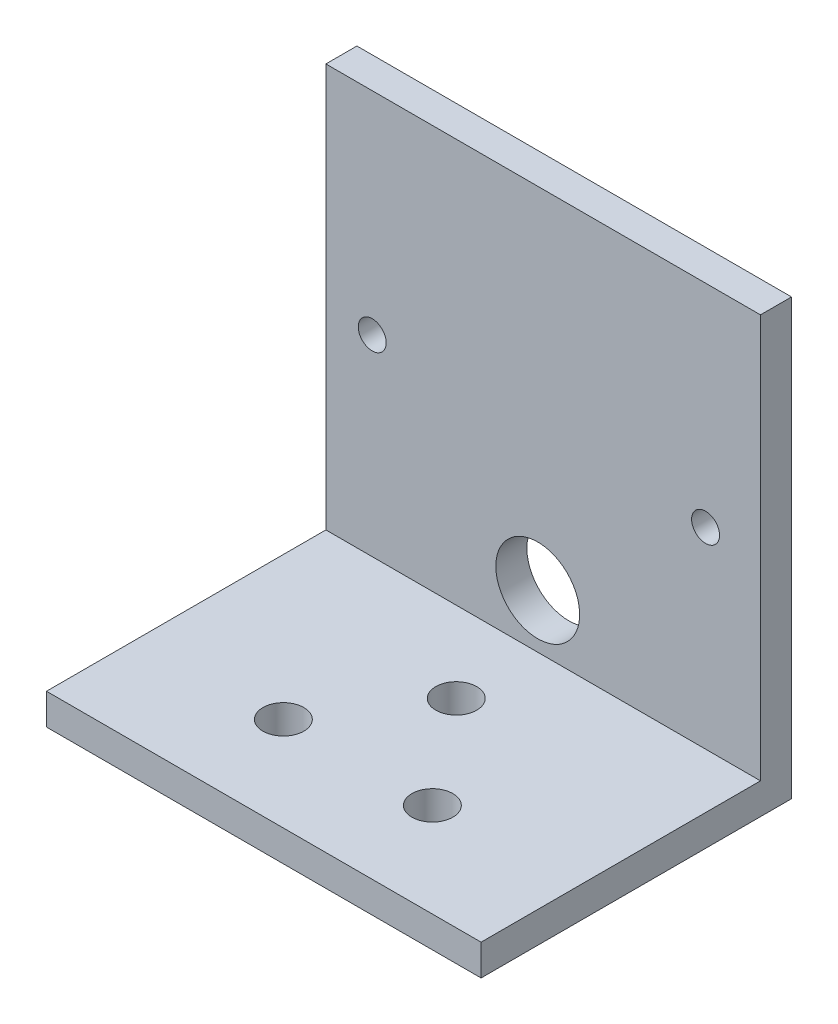
ISO-10303-21;
HEADER;
FILE_DESCRIPTION(('STEP AP214'),'2;1');
FILE_NAME('part.step','',(''),(''),'','','');
FILE_SCHEMA(('AUTOMOTIVE_DESIGN { 1 0 10303 214 1 1 1 1 }'));
ENDSEC;
DATA;
#1=APPLICATION_CONTEXT('core data for automotive mechanical design processes');
#2=APPLICATION_PROTOCOL_DEFINITION('international standard','automotive_design',2000,#1);
#3=PRODUCT_CONTEXT('',#1,'mechanical');
#4=PRODUCT('Part','Part','',(#3));
#5=PRODUCT_RELATED_PRODUCT_CATEGORY('part','',(#4));
#6=PRODUCT_DEFINITION_FORMATION('','',#4);
#7=PRODUCT_DEFINITION_CONTEXT('part definition',#1,'design');
#8=PRODUCT_DEFINITION('design','',#6,#7);
#9=PRODUCT_DEFINITION_SHAPE('','',#8);
#10=(LENGTH_UNIT() NAMED_UNIT(*) SI_UNIT(.MILLI.,.METRE.));
#11=(NAMED_UNIT(*) PLANE_ANGLE_UNIT() SI_UNIT($,.RADIAN.));
#12=(NAMED_UNIT(*) SI_UNIT($,.STERADIAN.) SOLID_ANGLE_UNIT());
#13=UNCERTAINTY_MEASURE_WITH_UNIT(LENGTH_MEASURE(1.E-05),#10,'distance_accuracy_value','');
#14=(GEOMETRIC_REPRESENTATION_CONTEXT(3) GLOBAL_UNCERTAINTY_ASSIGNED_CONTEXT((#13)) GLOBAL_UNIT_ASSIGNED_CONTEXT((#10,
#11,#12)) REPRESENTATION_CONTEXT('',''));
#15=CARTESIAN_POINT('',(0.,0.,0.));
#16=DIRECTION('',(0.,0.,1.));
#17=DIRECTION('',(1.,0.,0.));
#18=AXIS2_PLACEMENT_3D('',#15,#16,#17);
#19=CARTESIAN_POINT('',(35.,-35.,50.));
#20=DIRECTION('',(-1.,0.,0.));
#21=DIRECTION('',(0.,0.,1.));
#22=AXIS2_PLACEMENT_3D('',#19,#20,#21);
#23=PLANE('',#22);
#24=DIRECTION('',(0.,1.,0.));
#25=VECTOR('',#24,1.);
#26=CARTESIAN_POINT('',(35.,-30.,5.));
#27=LINE('',#26,#25);
#28=CARTESIAN_POINT('',(35.,-30.,5.));
#29=VERTEX_POINT('',#28);
#30=CARTESIAN_POINT('',(35.,35.,5.));
#31=VERTEX_POINT('',#30);
#32=EDGE_CURVE('E128',#29,#31,#27,.T.);
#33=ORIENTED_EDGE('',*,*,#32,.F.);
#34=DIRECTION('',(0.,0.,-1.));
#35=VECTOR('',#34,1.);
#36=CARTESIAN_POINT('',(35.,-30.,128.137615707359));
#37=LINE('',#36,#35);
#38=CARTESIAN_POINT('',(35.,-30.,50.));
#39=VERTEX_POINT('',#38);
#40=EDGE_CURVE('E131',#39,#29,#37,.T.);
#41=ORIENTED_EDGE('',*,*,#40,.F.);
#42=DIRECTION('',(0.,1.,0.));
#43=VECTOR('',#42,1.);
#44=CARTESIAN_POINT('',(35.,-35.,50.));
#45=LINE('',#44,#43);
#46=CARTESIAN_POINT('',(35.,-35.,50.));
#47=VERTEX_POINT('',#46);
#48=EDGE_CURVE('E86',#47,#39,#45,.T.);
#49=ORIENTED_EDGE('',*,*,#48,.F.);
#50=DIRECTION('',(0.,0.,-1.));
#51=VECTOR('',#50,1.);
#52=CARTESIAN_POINT('',(35.,-35.,50.));
#53=LINE('',#52,#51);
#54=CARTESIAN_POINT('',(35.,-35.,0.));
#55=VERTEX_POINT('',#54);
#56=EDGE_CURVE('E79',#47,#55,#53,.T.);
#57=ORIENTED_EDGE('',*,*,#56,.T.);
#58=DIRECTION('',(0.,1.,0.));
#59=VECTOR('',#58,1.);
#60=CARTESIAN_POINT('',(35.,-35.,0.));
#61=LINE('',#60,#59);
#62=CARTESIAN_POINT('',(35.,35.,0.));
#63=VERTEX_POINT('',#62);
#64=EDGE_CURVE('E93',#55,#63,#61,.T.);
#65=ORIENTED_EDGE('',*,*,#64,.T.);
#66=DIRECTION('',(0.,0.,-1.));
#67=VECTOR('',#66,1.);
#68=CARTESIAN_POINT('',(35.,35.,50.));
#69=LINE('',#68,#67);
#70=EDGE_CURVE('E112',#31,#63,#69,.T.);
#71=ORIENTED_EDGE('',*,*,#70,.F.);
#72=EDGE_LOOP('',(#33,#41,#49,#57,#65,#71));
#73=FACE_BOUND('',#72,.T.);
#74=ADVANCED_FACE('F33',(#73),#23,.F.);
#75=CARTESIAN_POINT('',(-35.,35.,50.));
#76=DIRECTION('',(0.,-1.,0.));
#77=DIRECTION('',(0.,0.,-1.));
#78=AXIS2_PLACEMENT_3D('',#75,#76,#77);
#79=PLANE('',#78);
#80=DIRECTION('',(0.,0.,-1.));
#81=VECTOR('',#80,1.);
#82=CARTESIAN_POINT('',(-35.,35.,50.));
#83=LINE('',#82,#81);
#84=CARTESIAN_POINT('',(-35.,35.,5.));
#85=VERTEX_POINT('',#84);
#86=CARTESIAN_POINT('',(-35.,35.,0.));
#87=VERTEX_POINT('',#86);
#88=EDGE_CURVE('E110',#85,#87,#83,.T.);
#89=ORIENTED_EDGE('',*,*,#88,.F.);
#90=DIRECTION('',(1.,0.,0.));
#91=VECTOR('',#90,1.);
#92=CARTESIAN_POINT('',(-35.,35.,5.));
#93=LINE('',#92,#91);
#94=EDGE_CURVE('E100',#85,#31,#93,.T.);
#95=ORIENTED_EDGE('',*,*,#94,.T.);
#96=ORIENTED_EDGE('',*,*,#70,.T.);
#97=DIRECTION('',(-1.,0.,0.));
#98=VECTOR('',#97,1.);
#99=CARTESIAN_POINT('',(-35.,35.,0.));
#100=LINE('',#99,#98);
#101=EDGE_CURVE('E99',#63,#87,#100,.T.);
#102=ORIENTED_EDGE('',*,*,#101,.T.);
#103=EDGE_LOOP('',(#89,#95,#96,#102));
#104=FACE_BOUND('',#103,.T.);
#105=ADVANCED_FACE('F196',(#104),#79,.F.);
#106=CARTESIAN_POINT('',(-35.,-35.,50.));
#107=DIRECTION('',(1.,0.,0.));
#108=DIRECTION('',(0.,0.,-1.));
#109=AXIS2_PLACEMENT_3D('',#106,#107,#108);
#110=PLANE('',#109);
#111=DIRECTION('',(0.,-1.,0.));
#112=VECTOR('',#111,1.);
#113=CARTESIAN_POINT('',(-35.,-35.,50.));
#114=LINE('',#113,#112);
#115=CARTESIAN_POINT('',(-35.,-30.,50.));
#116=VERTEX_POINT('',#115);
#117=CARTESIAN_POINT('',(-35.,-35.,50.));
#118=VERTEX_POINT('',#117);
#119=EDGE_CURVE('E116',#116,#118,#114,.T.);
#120=ORIENTED_EDGE('',*,*,#119,.F.);
#121=DIRECTION('',(0.,0.,-1.));
#122=VECTOR('',#121,1.);
#123=CARTESIAN_POINT('',(-35.,-30.,50.));
#124=LINE('',#123,#122);
#125=CARTESIAN_POINT('',(-35.,-30.,5.));
#126=VERTEX_POINT('',#125);
#127=EDGE_CURVE('E48',#116,#126,#124,.T.);
#128=ORIENTED_EDGE('',*,*,#127,.T.);
#129=DIRECTION('',(0.,1.,0.));
#130=VECTOR('',#129,1.);
#131=CARTESIAN_POINT('',(-35.,-35.,5.));
#132=LINE('',#131,#130);
#133=EDGE_CURVE('E11',#126,#85,#132,.T.);
#134=ORIENTED_EDGE('',*,*,#133,.T.);
#135=ORIENTED_EDGE('',*,*,#88,.T.);
#136=DIRECTION('',(0.,-1.,0.));
#137=VECTOR('',#136,1.);
#138=CARTESIAN_POINT('',(-35.,-35.,0.));
#139=LINE('',#138,#137);
#140=CARTESIAN_POINT('',(-35.,-35.,0.));
#141=VERTEX_POINT('',#140);
#142=EDGE_CURVE('E87',#87,#141,#139,.T.);
#143=ORIENTED_EDGE('',*,*,#142,.T.);
#144=DIRECTION('',(0.,0.,-1.));
#145=VECTOR('',#144,1.);
#146=CARTESIAN_POINT('',(-35.,-35.,50.));
#147=LINE('',#146,#145);
#148=EDGE_CURVE('E82',#118,#141,#147,.T.);
#149=ORIENTED_EDGE('',*,*,#148,.F.);
#150=EDGE_LOOP('',(#120,#128,#134,#135,#143,#149));
#151=FACE_BOUND('',#150,.T.);
#152=ADVANCED_FACE('F120',(#151),#110,.F.);
#153=CARTESIAN_POINT('',(-35.,-35.,50.));
#154=DIRECTION('',(0.,1.,0.));
#155=DIRECTION('',(0.,0.,1.));
#156=AXIS2_PLACEMENT_3D('',#153,#154,#155);
#157=PLANE('',#156);
#158=CARTESIAN_POINT('',(-12.,-35.,34.8456480116514));
#159=DIRECTION('',(0.,1.,0.));
#160=DIRECTION('',(0.,0.,1.));
#161=AXIS2_PLACEMENT_3D('',#158,#159,#160);
#162=CIRCLE('',#161,3.3);
#163=CARTESIAN_POINT('',(-12.,-35.,38.1456480116514));
#164=VERTEX_POINT('',#163);
#165=EDGE_CURVE('E160',#164,#164,#162,.T.);
#166=ORIENTED_EDGE('',*,*,#165,.T.);
#167=EDGE_LOOP('',(#166));
#168=FACE_BOUND('',#167,.T.);
#169=CARTESIAN_POINT('',(12.,-35.,34.8456480116514));
#170=DIRECTION('',(0.,1.,0.));
#171=DIRECTION('',(0.,0.,1.));
#172=AXIS2_PLACEMENT_3D('',#169,#170,#171);
#173=CIRCLE('',#172,3.3);
#174=CARTESIAN_POINT('',(12.,-35.,38.1456480116514));
#175=VERTEX_POINT('',#174);
#176=EDGE_CURVE('E154',#175,#175,#173,.T.);
#177=ORIENTED_EDGE('',*,*,#176,.T.);
#178=EDGE_LOOP('',(#177));
#179=FACE_BOUND('',#178,.T.);
#180=CARTESIAN_POINT('',(-0.99999999999998,-35.,18.));
#181=DIRECTION('',(0.,1.,0.));
#182=DIRECTION('',(0.,0.,1.));
#183=AXIS2_PLACEMENT_3D('',#180,#181,#182);
#184=CIRCLE('',#183,3.3);
#185=CARTESIAN_POINT('',(-0.99999999999998,-35.,21.3));
#186=VERTEX_POINT('',#185);
#187=EDGE_CURVE('E148',#186,#186,#184,.T.);
#188=ORIENTED_EDGE('',*,*,#187,.T.);
#189=EDGE_LOOP('',(#188));
#190=FACE_BOUND('',#189,.T.);
#191=DIRECTION('',(1.,0.,0.));
#192=VECTOR('',#191,1.);
#193=CARTESIAN_POINT('',(-35.,-35.,0.));
#194=LINE('',#193,#192);
#195=EDGE_CURVE('E76',#141,#55,#194,.T.);
#196=ORIENTED_EDGE('',*,*,#195,.T.);
#197=ORIENTED_EDGE('',*,*,#56,.F.);
#198=DIRECTION('',(1.,0.,0.));
#199=VECTOR('',#198,1.);
#200=CARTESIAN_POINT('',(-35.,-35.,50.));
#201=LINE('',#200,#199);
#202=EDGE_CURVE('E57',#118,#47,#201,.T.);
#203=ORIENTED_EDGE('',*,*,#202,.F.);
#204=ORIENTED_EDGE('',*,*,#148,.T.);
#205=EDGE_LOOP('',(#196,#197,#203,#204));
#206=FACE_BOUND('',#205,.T.);
#207=ADVANCED_FACE('F78',(#168,#179,#190,#206),#157,.F.);
#208=CARTESIAN_POINT('',(0.,0.,50.));
#209=DIRECTION('',(0.,0.,-1.));
#210=DIRECTION('',(-1.,0.,0.));
#211=AXIS2_PLACEMENT_3D('',#208,#209,#210);
#212=PLANE('',#211);
#213=ORIENTED_EDGE('',*,*,#48,.T.);
#214=DIRECTION('',(-1.,0.,0.));
#215=VECTOR('',#214,1.);
#216=CARTESIAN_POINT('',(0.,-30.,50.));
#217=LINE('',#216,#215);
#218=EDGE_CURVE('E41',#39,#116,#217,.T.);
#219=ORIENTED_EDGE('',*,*,#218,.T.);
#220=ORIENTED_EDGE('',*,*,#119,.T.);
#221=ORIENTED_EDGE('',*,*,#202,.T.);
#222=EDGE_LOOP('',(#213,#219,#220,#221));
#223=FACE_BOUND('',#222,.T.);
#224=ADVANCED_FACE('F115',(#223),#212,.F.);
#225=CARTESIAN_POINT('',(0.,0.,0.));
#226=DIRECTION('',(0.,0.,-1.));
#227=DIRECTION('',(-1.,0.,0.));
#228=AXIS2_PLACEMENT_3D('',#225,#226,#227);
#229=PLANE('',#228);
#230=CARTESIAN_POINT('',(-0.875458957650732,-21.3663952674459,0.));
#231=DIRECTION('',(0.,0.,-1.));
#232=DIRECTION('',(-1.,0.,0.));
#233=AXIS2_PLACEMENT_3D('',#230,#231,#232);
#234=CIRCLE('',#233,6.74999999999999);
#235=CARTESIAN_POINT('',(-7.62545895765073,-21.3663952674459,0.));
#236=VERTEX_POINT('',#235);
#237=EDGE_CURVE('E145',#236,#236,#234,.T.);
#238=ORIENTED_EDGE('',*,*,#237,.F.);
#239=EDGE_LOOP('',(#238));
#240=FACE_BOUND('',#239,.T.);
#241=CARTESIAN_POINT('',(26.1575779048771,0.946358973345163,0.));
#242=DIRECTION('',(0.,0.,-1.));
#243=DIRECTION('',(-1.,0.,0.));
#244=AXIS2_PLACEMENT_3D('',#241,#242,#243);
#245=CIRCLE('',#244,2.25);
#246=CARTESIAN_POINT('',(23.907577904877,0.946358973345163,0.));
#247=VERTEX_POINT('',#246);
#248=EDGE_CURVE('E139',#247,#247,#245,.T.);
#249=ORIENTED_EDGE('',*,*,#248,.F.);
#250=EDGE_LOOP('',(#249));
#251=FACE_BOUND('',#250,.T.);
#252=CARTESIAN_POINT('',(-27.5331176466196,0.946358973345163,0.));
#253=DIRECTION('',(0.,0.,-1.));
#254=DIRECTION('',(-1.,0.,0.));
#255=AXIS2_PLACEMENT_3D('',#252,#253,#254);
#256=CIRCLE('',#255,2.25);
#257=CARTESIAN_POINT('',(-29.7831176466196,0.946358973345163,0.));
#258=VERTEX_POINT('',#257);
#259=EDGE_CURVE('E136',#258,#258,#256,.T.);
#260=ORIENTED_EDGE('',*,*,#259,.F.);
#261=EDGE_LOOP('',(#260));
#262=FACE_BOUND('',#261,.T.);
#263=ORIENTED_EDGE('',*,*,#64,.F.);
#264=ORIENTED_EDGE('',*,*,#195,.F.);
#265=ORIENTED_EDGE('',*,*,#142,.F.);
#266=ORIENTED_EDGE('',*,*,#101,.F.);
#267=EDGE_LOOP('',(#263,#264,#265,#266));
#268=FACE_BOUND('',#267,.T.);
#269=ADVANCED_FACE('F97',(#240,#251,#262,#268),#229,.T.);
#270=CARTESIAN_POINT('',(-182.,-30.,5.));
#271=DIRECTION('',(0.,0.,-1.));
#272=DIRECTION('',(-1.,0.,0.));
#273=AXIS2_PLACEMENT_3D('',#270,#271,#272);
#274=PLANE('',#273);
#275=CARTESIAN_POINT('',(-0.875458957650732,-21.3663952674459,5.));
#276=DIRECTION('',(0.,0.,-1.));
#277=DIRECTION('',(-1.,0.,0.));
#278=AXIS2_PLACEMENT_3D('',#275,#276,#277);
#279=CIRCLE('',#278,6.74999999999999);
#280=CARTESIAN_POINT('',(-7.62545895765072,-21.3663952674459,5.));
#281=VERTEX_POINT('',#280);
#282=EDGE_CURVE('E142',#281,#281,#279,.T.);
#283=ORIENTED_EDGE('',*,*,#282,.T.);
#284=EDGE_LOOP('',(#283));
#285=FACE_BOUND('',#284,.T.);
#286=CARTESIAN_POINT('',(26.1575779048771,0.946358973345163,5.));
#287=DIRECTION('',(0.,0.,-1.));
#288=DIRECTION('',(-1.,0.,0.));
#289=AXIS2_PLACEMENT_3D('',#286,#287,#288);
#290=CIRCLE('',#289,2.25);
#291=CARTESIAN_POINT('',(23.9075779048771,0.946358973345163,5.));
#292=VERTEX_POINT('',#291);
#293=EDGE_CURVE('E36',#292,#292,#290,.T.);
#294=ORIENTED_EDGE('',*,*,#293,.T.);
#295=EDGE_LOOP('',(#294));
#296=FACE_BOUND('',#295,.T.);
#297=CARTESIAN_POINT('',(-27.5331176466196,0.946358973345163,5.));
#298=DIRECTION('',(0.,0.,-1.));
#299=DIRECTION('',(-1.,0.,0.));
#300=AXIS2_PLACEMENT_3D('',#297,#298,#299);
#301=CIRCLE('',#300,2.25);
#302=CARTESIAN_POINT('',(-29.7831176466196,0.946358973345163,5.));
#303=VERTEX_POINT('',#302);
#304=EDGE_CURVE('E133',#303,#303,#301,.T.);
#305=ORIENTED_EDGE('',*,*,#304,.T.);
#306=EDGE_LOOP('',(#305));
#307=FACE_BOUND('',#306,.T.);
#308=ORIENTED_EDGE('',*,*,#133,.F.);
#309=DIRECTION('',(1.,0.,0.));
#310=VECTOR('',#309,1.);
#311=CARTESIAN_POINT('',(-182.,-30.,5.));
#312=LINE('',#311,#310);
#313=EDGE_CURVE('E125',#126,#29,#312,.T.);
#314=ORIENTED_EDGE('',*,*,#313,.T.);
#315=ORIENTED_EDGE('',*,*,#32,.T.);
#316=ORIENTED_EDGE('',*,*,#94,.F.);
#317=EDGE_LOOP('',(#308,#314,#315,#316));
#318=FACE_BOUND('',#317,.T.);
#319=ADVANCED_FACE('F173',(#285,#296,#307,#318),#274,.F.);
#320=CARTESIAN_POINT('',(-182.,-30.,128.137615707359));
#321=DIRECTION('',(0.,-1.,0.));
#322=DIRECTION('',(0.,0.,-1.));
#323=AXIS2_PLACEMENT_3D('',#320,#321,#322);
#324=PLANE('',#323);
#325=CARTESIAN_POINT('',(-12.,-30.,34.8456480116514));
#326=DIRECTION('',(0.,1.,0.));
#327=DIRECTION('',(0.,0.,1.));
#328=AXIS2_PLACEMENT_3D('',#325,#326,#327);
#329=CIRCLE('',#328,3.3);
#330=CARTESIAN_POINT('',(-12.,-30.,38.1456480116514));
#331=VERTEX_POINT('',#330);
#332=EDGE_CURVE('E163',#331,#331,#329,.T.);
#333=ORIENTED_EDGE('',*,*,#332,.F.);
#334=EDGE_LOOP('',(#333));
#335=FACE_BOUND('',#334,.T.);
#336=CARTESIAN_POINT('',(12.,-30.,34.8456480116514));
#337=DIRECTION('',(0.,1.,0.));
#338=DIRECTION('',(0.,0.,1.));
#339=AXIS2_PLACEMENT_3D('',#336,#337,#338);
#340=CIRCLE('',#339,3.3);
#341=CARTESIAN_POINT('',(12.,-30.,38.1456480116514));
#342=VERTEX_POINT('',#341);
#343=EDGE_CURVE('E157',#342,#342,#340,.T.);
#344=ORIENTED_EDGE('',*,*,#343,.F.);
#345=EDGE_LOOP('',(#344));
#346=FACE_BOUND('',#345,.T.);
#347=CARTESIAN_POINT('',(-0.99999999999998,-30.,18.));
#348=DIRECTION('',(0.,1.,0.));
#349=DIRECTION('',(0.,0.,1.));
#350=AXIS2_PLACEMENT_3D('',#347,#348,#349);
#351=CIRCLE('',#350,3.3);
#352=CARTESIAN_POINT('',(-0.99999999999998,-30.,21.3));
#353=VERTEX_POINT('',#352);
#354=EDGE_CURVE('E151',#353,#353,#351,.T.);
#355=ORIENTED_EDGE('',*,*,#354,.F.);
#356=EDGE_LOOP('',(#355));
#357=FACE_BOUND('',#356,.T.);
#358=ORIENTED_EDGE('',*,*,#218,.F.);
#359=ORIENTED_EDGE('',*,*,#40,.T.);
#360=ORIENTED_EDGE('',*,*,#313,.F.);
#361=ORIENTED_EDGE('',*,*,#127,.F.);
#362=EDGE_LOOP('',(#358,#359,#360,#361));
#363=FACE_BOUND('',#362,.T.);
#364=ADVANCED_FACE('F169',(#335,#346,#357,#363),#324,.F.);
#365=CARTESIAN_POINT('',(-27.5331176466196,0.946358973345163,0.));
#366=DIRECTION('',(0.,0.,-1.));
#367=DIRECTION('',(-1.,0.,0.));
#368=AXIS2_PLACEMENT_3D('',#365,#366,#367);
#369=CYLINDRICAL_SURFACE('',#368,2.25);
#370=ORIENTED_EDGE('',*,*,#259,.T.);
#371=EDGE_LOOP('',(#370));
#372=FACE_BOUND('',#371,.T.);
#373=ORIENTED_EDGE('',*,*,#304,.F.);
#374=EDGE_LOOP('',(#373));
#375=FACE_BOUND('',#374,.T.);
#376=ADVANCED_FACE('F172',(#372,#375),#369,.F.);
#377=CARTESIAN_POINT('',(26.1575779048771,0.946358973345163,0.));
#378=DIRECTION('',(0.,0.,-1.));
#379=DIRECTION('',(-1.,0.,0.));
#380=AXIS2_PLACEMENT_3D('',#377,#378,#379);
#381=CYLINDRICAL_SURFACE('',#380,2.25);
#382=ORIENTED_EDGE('',*,*,#248,.T.);
#383=EDGE_LOOP('',(#382));
#384=FACE_BOUND('',#383,.T.);
#385=ORIENTED_EDGE('',*,*,#293,.F.);
#386=EDGE_LOOP('',(#385));
#387=FACE_BOUND('',#386,.T.);
#388=ADVANCED_FACE('F191',(#384,#387),#381,.F.);
#389=CARTESIAN_POINT('',(-0.875458957650732,-21.3663952674459,0.));
#390=DIRECTION('',(0.,0.,-1.));
#391=DIRECTION('',(-1.,0.,0.));
#392=AXIS2_PLACEMENT_3D('',#389,#390,#391);
#393=CYLINDRICAL_SURFACE('',#392,6.74999999999999);
#394=ORIENTED_EDGE('',*,*,#237,.T.);
#395=EDGE_LOOP('',(#394));
#396=FACE_BOUND('',#395,.T.);
#397=ORIENTED_EDGE('',*,*,#282,.F.);
#398=EDGE_LOOP('',(#397));
#399=FACE_BOUND('',#398,.T.);
#400=ADVANCED_FACE('F182',(#396,#399),#393,.F.);
#401=CARTESIAN_POINT('',(-0.99999999999998,-30.,18.));
#402=DIRECTION('',(0.,1.,0.));
#403=DIRECTION('',(0.,0.,1.));
#404=AXIS2_PLACEMENT_3D('',#401,#402,#403);
#405=CYLINDRICAL_SURFACE('',#404,3.3);
#406=ORIENTED_EDGE('',*,*,#187,.F.);
#407=EDGE_LOOP('',(#406));
#408=FACE_BOUND('',#407,.T.);
#409=ORIENTED_EDGE('',*,*,#354,.T.);
#410=EDGE_LOOP('',(#409));
#411=FACE_BOUND('',#410,.T.);
#412=ADVANCED_FACE('F179',(#408,#411),#405,.F.);
#413=CARTESIAN_POINT('',(12.,-30.,34.8456480116514));
#414=DIRECTION('',(0.,1.,0.));
#415=DIRECTION('',(0.,0.,1.));
#416=AXIS2_PLACEMENT_3D('',#413,#414,#415);
#417=CYLINDRICAL_SURFACE('',#416,3.3);
#418=ORIENTED_EDGE('',*,*,#176,.F.);
#419=EDGE_LOOP('',(#418));
#420=FACE_BOUND('',#419,.T.);
#421=ORIENTED_EDGE('',*,*,#343,.T.);
#422=EDGE_LOOP('',(#421));
#423=FACE_BOUND('',#422,.T.);
#424=ADVANCED_FACE('F181',(#420,#423),#417,.F.);
#425=CARTESIAN_POINT('',(-12.,-30.,34.8456480116514));
#426=DIRECTION('',(0.,1.,0.));
#427=DIRECTION('',(0.,0.,1.));
#428=AXIS2_PLACEMENT_3D('',#425,#426,#427);
#429=CYLINDRICAL_SURFACE('',#428,3.3);
#430=ORIENTED_EDGE('',*,*,#165,.F.);
#431=EDGE_LOOP('',(#430));
#432=FACE_BOUND('',#431,.T.);
#433=ORIENTED_EDGE('',*,*,#332,.T.);
#434=EDGE_LOOP('',(#433));
#435=FACE_BOUND('',#434,.T.);
#436=ADVANCED_FACE('F167',(#432,#435),#429,.F.);
#437=CLOSED_SHELL('',(#74,#105,#152,#207,#224,#269,#319,#364,#376,#388,#400,#412,#424,#436));
#438=MANIFOLD_SOLID_BREP('B2',#437);
#439=ADVANCED_BREP_SHAPE_REPRESENTATION('',(#18,#438),#14);
#440=SHAPE_DEFINITION_REPRESENTATION(#9,#439);
ENDSEC;
END-ISO-10303-21;
